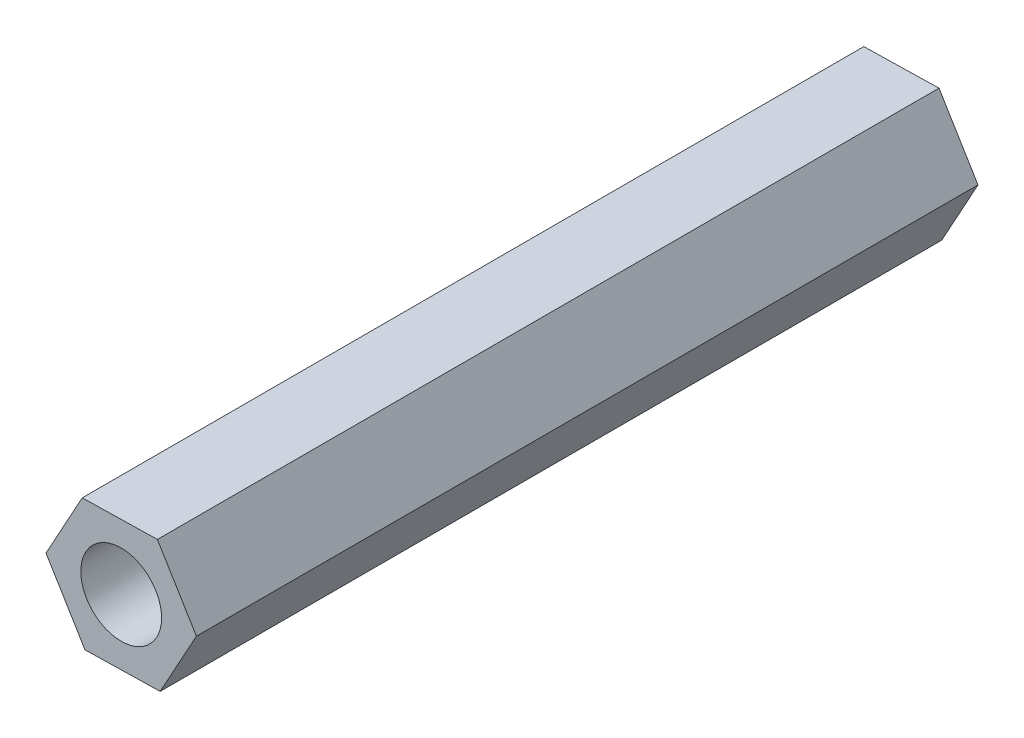
ISO-10303-21;
HEADER;
FILE_DESCRIPTION(('STEP AP214'),'2;1');
FILE_NAME('part.step','',(''),(''),'','','');
FILE_SCHEMA(('AUTOMOTIVE_DESIGN { 1 0 10303 214 1 1 1 1 }'));
ENDSEC;
DATA;
#1=APPLICATION_CONTEXT('core data for automotive mechanical design processes');
#2=APPLICATION_PROTOCOL_DEFINITION('international standard','automotive_design',2000,#1);
#3=PRODUCT_CONTEXT('',#1,'mechanical');
#4=PRODUCT('Part','Part','',(#3));
#5=PRODUCT_RELATED_PRODUCT_CATEGORY('part','',(#4));
#6=PRODUCT_DEFINITION_FORMATION('','',#4);
#7=PRODUCT_DEFINITION_CONTEXT('part definition',#1,'design');
#8=PRODUCT_DEFINITION('design','',#6,#7);
#9=PRODUCT_DEFINITION_SHAPE('','',#8);
#10=(LENGTH_UNIT() NAMED_UNIT(*) SI_UNIT(.MILLI.,.METRE.));
#11=(NAMED_UNIT(*) PLANE_ANGLE_UNIT() SI_UNIT($,.RADIAN.));
#12=(NAMED_UNIT(*) SI_UNIT($,.STERADIAN.) SOLID_ANGLE_UNIT());
#13=UNCERTAINTY_MEASURE_WITH_UNIT(LENGTH_MEASURE(1.E-05),#10,'distance_accuracy_value','');
#14=(GEOMETRIC_REPRESENTATION_CONTEXT(3) GLOBAL_UNCERTAINTY_ASSIGNED_CONTEXT((#13)) GLOBAL_UNIT_ASSIGNED_CONTEXT((#10,
#11,#12)) REPRESENTATION_CONTEXT('',''));
#15=CARTESIAN_POINT('',(0.,0.,0.));
#16=DIRECTION('',(0.,0.,1.));
#17=DIRECTION('',(1.,0.,0.));
#18=AXIS2_PLACEMENT_3D('',#15,#16,#17);
#19=CARTESIAN_POINT('',(0.,0.,30.));
#20=DIRECTION('',(0.,0.,1.));
#21=DIRECTION('',(1.,0.,0.));
#22=AXIS2_PLACEMENT_3D('',#19,#20,#21);
#23=PLANE('',#22);
#24=DIRECTION('',(-0.51832844731217,0.8551816302441,0.));
#25=VECTOR('',#24,1.);
#26=CARTESIAN_POINT('',(2.88609674707105,0.0614727572117899,30.));
#27=LINE('',#26,#25);
#28=CARTESIAN_POINT('',(2.88609674707105,0.0614727572117899,30.));
#29=VERTEX_POINT('',#28);
#30=CARTESIAN_POINT('',(1.38981140414944,2.53016947934906,30.));
#31=VERTEX_POINT('',#30);
#32=EDGE_CURVE('E130',#29,#31,#27,.T.);
#33=ORIENTED_EDGE('',*,*,#32,.T.);
#34=DIRECTION('',(-0.999773240297266,-0.0212947877544332,0.));
#35=VECTOR('',#34,1.);
#36=CARTESIAN_POINT('',(1.38981140414944,2.53016947934906,30.));
#37=LINE('',#36,#35);
#38=CARTESIAN_POINT('',(-1.49628534292161,2.46869672213727,30.));
#39=VERTEX_POINT('',#38);
#40=EDGE_CURVE('E88',#31,#39,#37,.T.);
#41=ORIENTED_EDGE('',*,*,#40,.T.);
#42=DIRECTION('',(-0.481444792985096,-0.876476417998533,0.));
#43=VECTOR('',#42,1.);
#44=CARTESIAN_POINT('',(-1.49628534292161,2.46869672213727,30.));
#45=LINE('',#44,#43);
#46=CARTESIAN_POINT('',(-2.88609674707105,-0.0614727572117905,30.));
#47=VERTEX_POINT('',#46);
#48=EDGE_CURVE('E101',#39,#47,#45,.T.);
#49=ORIENTED_EDGE('',*,*,#48,.T.);
#50=DIRECTION('',(0.51832844731217,-0.855181630244099,0.));
#51=VECTOR('',#50,1.);
#52=CARTESIAN_POINT('',(-2.88609674707105,-0.0614727572117905,30.));
#53=LINE('',#52,#51);
#54=CARTESIAN_POINT('',(-1.38981140414945,-2.53016947934906,30.));
#55=VERTEX_POINT('',#54);
#56=EDGE_CURVE('E95',#47,#55,#53,.T.);
#57=ORIENTED_EDGE('',*,*,#56,.T.);
#58=DIRECTION('',(0.999773240297265,0.0212947877544332,0.));
#59=VECTOR('',#58,1.);
#60=CARTESIAN_POINT('',(-1.38981140414945,-2.53016947934906,30.));
#61=LINE('',#60,#59);
#62=CARTESIAN_POINT('',(1.49628534292161,-2.46869672213727,30.));
#63=VERTEX_POINT('',#62);
#64=EDGE_CURVE('E99',#55,#63,#61,.T.);
#65=ORIENTED_EDGE('',*,*,#64,.T.);
#66=DIRECTION('',(0.481444792985095,0.876476417998533,0.));
#67=VECTOR('',#66,1.);
#68=CARTESIAN_POINT('',(1.49628534292161,-2.46869672213727,30.));
#69=LINE('',#68,#67);
#70=EDGE_CURVE('E51',#63,#29,#69,.T.);
#71=ORIENTED_EDGE('',*,*,#70,.T.);
#72=EDGE_LOOP('',(#33,#41,#49,#57,#65,#71));
#73=FACE_BOUND('',#72,.T.);
#74=CARTESIAN_POINT('',(0.,0.,30.));
#75=DIRECTION('',(0.,0.,1.));
#76=DIRECTION('',(1.,0.,0.));
#77=AXIS2_PLACEMENT_3D('',#74,#75,#76);
#78=CIRCLE('',#77,1.55);
#79=CARTESIAN_POINT('',(1.55,0.,30.));
#80=VERTEX_POINT('',#79);
#81=EDGE_CURVE('E123',#80,#80,#78,.T.);
#82=ORIENTED_EDGE('',*,*,#81,.F.);
#83=EDGE_LOOP('',(#82));
#84=FACE_BOUND('',#83,.T.);
#85=ADVANCED_FACE('F34',(#73,#84),#23,.T.);
#86=CARTESIAN_POINT('',(0.,0.,0.));
#87=DIRECTION('',(0.,0.,1.));
#88=DIRECTION('',(1.,0.,0.));
#89=AXIS2_PLACEMENT_3D('',#86,#87,#88);
#90=PLANE('',#89);
#91=DIRECTION('',(-0.51832844731217,0.8551816302441,0.));
#92=VECTOR('',#91,1.);
#93=CARTESIAN_POINT('',(2.88609674707105,0.0614727572117899,0.));
#94=LINE('',#93,#92);
#95=CARTESIAN_POINT('',(2.88609674707105,0.0614727572117899,0.));
#96=VERTEX_POINT('',#95);
#97=CARTESIAN_POINT('',(1.38981140414944,2.53016947934906,0.));
#98=VERTEX_POINT('',#97);
#99=EDGE_CURVE('E119',#96,#98,#94,.T.);
#100=ORIENTED_EDGE('',*,*,#99,.F.);
#101=DIRECTION('',(0.481444792985095,0.876476417998533,0.));
#102=VECTOR('',#101,1.);
#103=CARTESIAN_POINT('',(1.49628534292161,-2.46869672213727,0.));
#104=LINE('',#103,#102);
#105=CARTESIAN_POINT('',(1.49628534292161,-2.46869672213727,0.));
#106=VERTEX_POINT('',#105);
#107=EDGE_CURVE('E80',#106,#96,#104,.T.);
#108=ORIENTED_EDGE('',*,*,#107,.F.);
#109=DIRECTION('',(0.999773240297265,0.0212947877544332,0.));
#110=VECTOR('',#109,1.);
#111=CARTESIAN_POINT('',(-1.38981140414945,-2.53016947934906,0.));
#112=LINE('',#111,#110);
#113=CARTESIAN_POINT('',(-1.38981140414945,-2.53016947934906,0.));
#114=VERTEX_POINT('',#113);
#115=EDGE_CURVE('E74',#114,#106,#112,.T.);
#116=ORIENTED_EDGE('',*,*,#115,.F.);
#117=DIRECTION('',(0.51832844731217,-0.855181630244099,0.));
#118=VECTOR('',#117,1.);
#119=CARTESIAN_POINT('',(-2.88609674707105,-0.0614727572117905,0.));
#120=LINE('',#119,#118);
#121=CARTESIAN_POINT('',(-2.88609674707105,-0.0614727572117905,0.));
#122=VERTEX_POINT('',#121);
#123=EDGE_CURVE('E109',#122,#114,#120,.T.);
#124=ORIENTED_EDGE('',*,*,#123,.F.);
#125=DIRECTION('',(-0.481444792985096,-0.876476417998533,0.));
#126=VECTOR('',#125,1.);
#127=CARTESIAN_POINT('',(-1.49628534292161,2.46869672213727,0.));
#128=LINE('',#127,#126);
#129=CARTESIAN_POINT('',(-1.49628534292161,2.46869672213727,0.));
#130=VERTEX_POINT('',#129);
#131=EDGE_CURVE('E125',#130,#122,#128,.T.);
#132=ORIENTED_EDGE('',*,*,#131,.F.);
#133=DIRECTION('',(-0.999773240297266,-0.0212947877544332,0.));
#134=VECTOR('',#133,1.);
#135=CARTESIAN_POINT('',(1.38981140414944,2.53016947934906,0.));
#136=LINE('',#135,#134);
#137=EDGE_CURVE('E122',#98,#130,#136,.T.);
#138=ORIENTED_EDGE('',*,*,#137,.F.);
#139=EDGE_LOOP('',(#100,#108,#116,#124,#132,#138));
#140=FACE_BOUND('',#139,.T.);
#141=CARTESIAN_POINT('',(0.,0.,0.));
#142=DIRECTION('',(0.,0.,1.));
#143=DIRECTION('',(1.,0.,0.));
#144=AXIS2_PLACEMENT_3D('',#141,#142,#143);
#145=CIRCLE('',#144,1.55);
#146=CARTESIAN_POINT('',(1.55,0.,0.));
#147=VERTEX_POINT('',#146);
#148=EDGE_CURVE('E223',#147,#147,#145,.T.);
#149=ORIENTED_EDGE('',*,*,#148,.T.);
#150=EDGE_LOOP('',(#149));
#151=FACE_BOUND('',#150,.T.);
#152=ADVANCED_FACE('F139',(#140,#151),#90,.F.);
#153=CARTESIAN_POINT('',(2.88609674707105,0.0614727572117899,30.));
#154=DIRECTION('',(-0.855181630244099,-0.518328447312169,0.));
#155=DIRECTION('',(0.51832844731217,-0.8551816302441,0.));
#156=AXIS2_PLACEMENT_3D('',#153,#154,#155);
#157=PLANE('',#156);
#158=ORIENTED_EDGE('',*,*,#99,.T.);
#159=DIRECTION('',(0.,0.,-1.));
#160=VECTOR('',#159,1.);
#161=CARTESIAN_POINT('',(1.38981140414944,2.53016947934906,30.));
#162=LINE('',#161,#160);
#163=EDGE_CURVE('E11',#31,#98,#162,.T.);
#164=ORIENTED_EDGE('',*,*,#163,.F.);
#165=ORIENTED_EDGE('',*,*,#32,.F.);
#166=DIRECTION('',(0.,0.,-1.));
#167=VECTOR('',#166,1.);
#168=CARTESIAN_POINT('',(2.88609674707105,0.0614727572117899,30.));
#169=LINE('',#168,#167);
#170=EDGE_CURVE('E115',#29,#96,#169,.T.);
#171=ORIENTED_EDGE('',*,*,#170,.T.);
#172=EDGE_LOOP('',(#158,#164,#165,#171));
#173=FACE_BOUND('',#172,.T.);
#174=ADVANCED_FACE('F36',(#173),#157,.F.);
#175=CARTESIAN_POINT('',(1.38981140414944,2.53016947934906,30.));
#176=DIRECTION('',(0.0212947877544332,-0.999773240297265,0.));
#177=DIRECTION('',(0.999773240297266,0.0212947877544332,0.));
#178=AXIS2_PLACEMENT_3D('',#175,#176,#177);
#179=PLANE('',#178);
#180=ORIENTED_EDGE('',*,*,#137,.T.);
#181=DIRECTION('',(0.,0.,-1.));
#182=VECTOR('',#181,1.);
#183=CARTESIAN_POINT('',(-1.49628534292161,2.46869672213727,30.));
#184=LINE('',#183,#182);
#185=EDGE_CURVE('E43',#39,#130,#184,.T.);
#186=ORIENTED_EDGE('',*,*,#185,.F.);
#187=ORIENTED_EDGE('',*,*,#40,.F.);
#188=ORIENTED_EDGE('',*,*,#163,.T.);
#189=EDGE_LOOP('',(#180,#186,#187,#188));
#190=FACE_BOUND('',#189,.T.);
#191=ADVANCED_FACE('F164',(#190),#179,.F.);
#192=CARTESIAN_POINT('',(-1.49628534292161,2.46869672213727,30.));
#193=DIRECTION('',(0.876476417998533,-0.481444792985096,0.));
#194=DIRECTION('',(0.481444792985096,0.876476417998533,0.));
#195=AXIS2_PLACEMENT_3D('',#192,#193,#194);
#196=PLANE('',#195);
#197=ORIENTED_EDGE('',*,*,#131,.T.);
#198=DIRECTION('',(0.,0.,-1.));
#199=VECTOR('',#198,1.);
#200=CARTESIAN_POINT('',(-2.88609674707105,-0.0614727572117905,30.));
#201=LINE('',#200,#199);
#202=EDGE_CURVE('E110',#47,#122,#201,.T.);
#203=ORIENTED_EDGE('',*,*,#202,.F.);
#204=ORIENTED_EDGE('',*,*,#48,.F.);
#205=ORIENTED_EDGE('',*,*,#185,.T.);
#206=EDGE_LOOP('',(#197,#203,#204,#205));
#207=FACE_BOUND('',#206,.T.);
#208=ADVANCED_FACE('F136',(#207),#196,.F.);
#209=CARTESIAN_POINT('',(-2.88609674707105,-0.0614727572117905,30.));
#210=DIRECTION('',(0.855181630244099,0.51832844731217,0.));
#211=DIRECTION('',(-0.51832844731217,0.855181630244099,0.));
#212=AXIS2_PLACEMENT_3D('',#209,#210,#211);
#213=PLANE('',#212);
#214=ORIENTED_EDGE('',*,*,#123,.T.);
#215=DIRECTION('',(0.,0.,-1.));
#216=VECTOR('',#215,1.);
#217=CARTESIAN_POINT('',(-1.38981140414945,-2.53016947934906,30.));
#218=LINE('',#217,#216);
#219=EDGE_CURVE('E106',#55,#114,#218,.T.);
#220=ORIENTED_EDGE('',*,*,#219,.F.);
#221=ORIENTED_EDGE('',*,*,#56,.F.);
#222=ORIENTED_EDGE('',*,*,#202,.T.);
#223=EDGE_LOOP('',(#214,#220,#221,#222));
#224=FACE_BOUND('',#223,.T.);
#225=ADVANCED_FACE('F107',(#224),#213,.F.);
#226=CARTESIAN_POINT('',(-1.38981140414945,-2.53016947934906,30.));
#227=DIRECTION('',(-0.0212947877544332,0.999773240297265,0.));
#228=DIRECTION('',(-0.999773240297265,-0.0212947877544332,0.));
#229=AXIS2_PLACEMENT_3D('',#226,#227,#228);
#230=PLANE('',#229);
#231=ORIENTED_EDGE('',*,*,#115,.T.);
#232=DIRECTION('',(0.,0.,-1.));
#233=VECTOR('',#232,1.);
#234=CARTESIAN_POINT('',(1.49628534292161,-2.46869672213727,30.));
#235=LINE('',#234,#233);
#236=EDGE_CURVE('E111',#63,#106,#235,.T.);
#237=ORIENTED_EDGE('',*,*,#236,.F.);
#238=ORIENTED_EDGE('',*,*,#64,.F.);
#239=ORIENTED_EDGE('',*,*,#219,.T.);
#240=EDGE_LOOP('',(#231,#237,#238,#239));
#241=FACE_BOUND('',#240,.T.);
#242=ADVANCED_FACE('F113',(#241),#230,.F.);
#243=CARTESIAN_POINT('',(1.49628534292161,-2.46869672213727,30.));
#244=DIRECTION('',(-0.876476417998533,0.481444792985095,0.));
#245=DIRECTION('',(-0.481444792985095,-0.876476417998533,0.));
#246=AXIS2_PLACEMENT_3D('',#243,#244,#245);
#247=PLANE('',#246);
#248=ORIENTED_EDGE('',*,*,#107,.T.);
#249=ORIENTED_EDGE('',*,*,#170,.F.);
#250=ORIENTED_EDGE('',*,*,#70,.F.);
#251=ORIENTED_EDGE('',*,*,#236,.T.);
#252=EDGE_LOOP('',(#248,#249,#250,#251));
#253=FACE_BOUND('',#252,.T.);
#254=ADVANCED_FACE('F144',(#253),#247,.F.);
#255=CARTESIAN_POINT('',(0.,0.,30.));
#256=DIRECTION('',(0.,0.,-1.));
#257=DIRECTION('',(-1.,0.,0.));
#258=AXIS2_PLACEMENT_3D('',#255,#256,#257);
#259=CYLINDRICAL_SURFACE('',#258,1.55);
#260=ORIENTED_EDGE('',*,*,#81,.T.);
#261=EDGE_LOOP('',(#260));
#262=FACE_BOUND('',#261,.T.);
#263=ORIENTED_EDGE('',*,*,#148,.F.);
#264=EDGE_LOOP('',(#263));
#265=FACE_BOUND('',#264,.T.);
#266=ADVANCED_FACE('F146',(#262,#265),#259,.F.);
#267=CLOSED_SHELL('',(#85,#152,#174,#191,#208,#225,#242,#254,#266));
#268=MANIFOLD_SOLID_BREP('B2',#267);
#269=ADVANCED_BREP_SHAPE_REPRESENTATION('',(#18,#268),#14);
#270=SHAPE_DEFINITION_REPRESENTATION(#9,#269);
ENDSEC;
END-ISO-10303-21;
